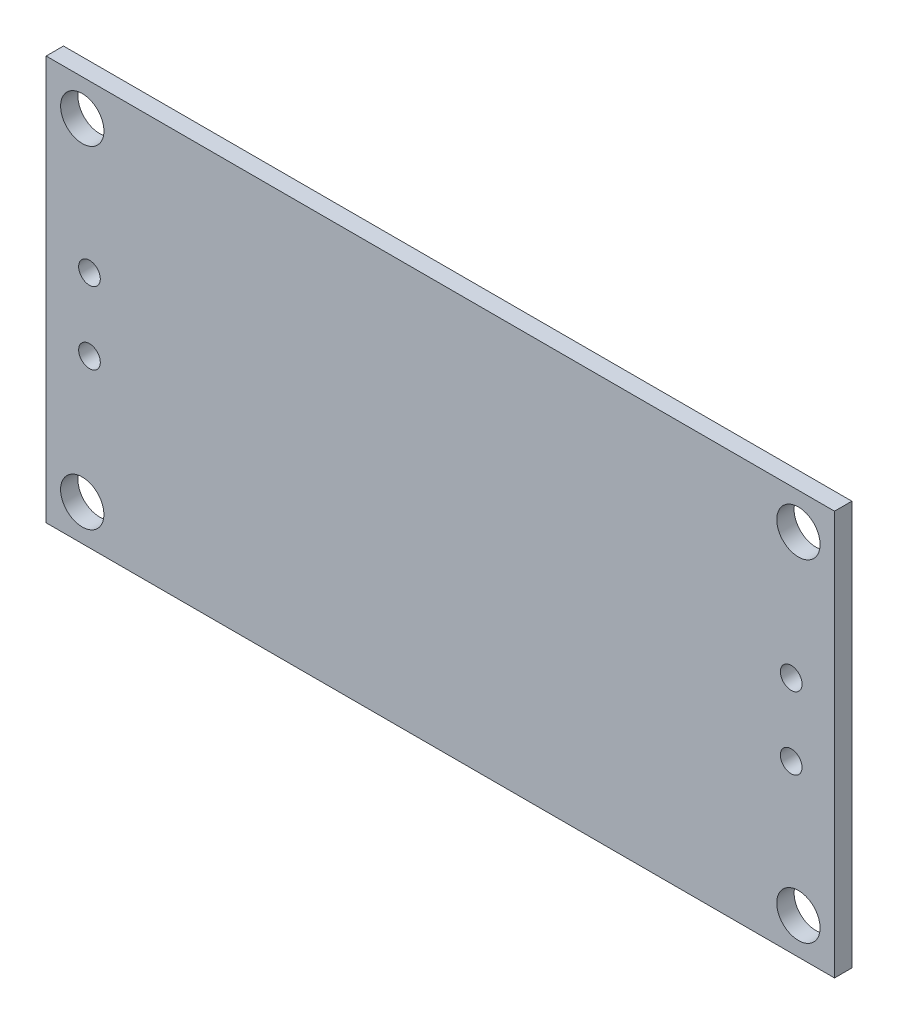
ISO-10303-21;
HEADER;
FILE_DESCRIPTION(('STEP AP214'),'2;1');
FILE_NAME('part.step','',(''),(''),'','','');
FILE_SCHEMA(('AUTOMOTIVE_DESIGN { 1 0 10303 214 1 1 1 1 }'));
ENDSEC;
DATA;
#1=APPLICATION_CONTEXT('core data for automotive mechanical design processes');
#2=APPLICATION_PROTOCOL_DEFINITION('international standard','automotive_design',2000,#1);
#3=PRODUCT_CONTEXT('',#1,'mechanical');
#4=PRODUCT('Part','Part','',(#3));
#5=PRODUCT_RELATED_PRODUCT_CATEGORY('part','',(#4));
#6=PRODUCT_DEFINITION_FORMATION('','',#4);
#7=PRODUCT_DEFINITION_CONTEXT('part definition',#1,'design');
#8=PRODUCT_DEFINITION('design','',#6,#7);
#9=PRODUCT_DEFINITION_SHAPE('','',#8);
#10=(LENGTH_UNIT() NAMED_UNIT(*) SI_UNIT(.MILLI.,.METRE.));
#11=(NAMED_UNIT(*) PLANE_ANGLE_UNIT() SI_UNIT($,.RADIAN.));
#12=(NAMED_UNIT(*) SI_UNIT($,.STERADIAN.) SOLID_ANGLE_UNIT());
#13=UNCERTAINTY_MEASURE_WITH_UNIT(LENGTH_MEASURE(1.E-05),#10,'distance_accuracy_value','');
#14=(GEOMETRIC_REPRESENTATION_CONTEXT(3) GLOBAL_UNCERTAINTY_ASSIGNED_CONTEXT((#13)) GLOBAL_UNIT_ASSIGNED_CONTEXT((#10,
#11,#12)) REPRESENTATION_CONTEXT('',''));
#15=CARTESIAN_POINT('',(0.,0.,0.));
#16=DIRECTION('',(0.,0.,1.));
#17=DIRECTION('',(1.,0.,0.));
#18=AXIS2_PLACEMENT_3D('',#15,#16,#17);
#19=CARTESIAN_POINT('',(27.3,-14.,1.2));
#20=DIRECTION('',(-1.,0.,0.));
#21=DIRECTION('',(0.,0.,1.));
#22=AXIS2_PLACEMENT_3D('',#19,#20,#21);
#23=PLANE('',#22);
#24=DIRECTION('',(0.,1.,0.));
#25=VECTOR('',#24,1.);
#26=CARTESIAN_POINT('',(27.3,-14.,0.));
#27=LINE('',#26,#25);
#28=CARTESIAN_POINT('',(27.3,-14.,0.));
#29=VERTEX_POINT('',#28);
#30=CARTESIAN_POINT('',(27.3,14.,0.));
#31=VERTEX_POINT('',#30);
#32=EDGE_CURVE('E97',#29,#31,#27,.T.);
#33=ORIENTED_EDGE('',*,*,#32,.T.);
#34=DIRECTION('',(0.,0.,-1.));
#35=VECTOR('',#34,1.);
#36=CARTESIAN_POINT('',(27.3,14.,1.2));
#37=LINE('',#36,#35);
#38=CARTESIAN_POINT('',(27.3,14.,1.2));
#39=VERTEX_POINT('',#38);
#40=EDGE_CURVE('E11',#39,#31,#37,.T.);
#41=ORIENTED_EDGE('',*,*,#40,.F.);
#42=DIRECTION('',(0.,1.,0.));
#43=VECTOR('',#42,1.);
#44=CARTESIAN_POINT('',(27.3,-14.,1.2));
#45=LINE('',#44,#43);
#46=CARTESIAN_POINT('',(27.3,-14.,1.2));
#47=VERTEX_POINT('',#46);
#48=EDGE_CURVE('E85',#47,#39,#45,.T.);
#49=ORIENTED_EDGE('',*,*,#48,.F.);
#50=DIRECTION('',(0.,0.,-1.));
#51=VECTOR('',#50,1.);
#52=CARTESIAN_POINT('',(27.3,-14.,1.2));
#53=LINE('',#52,#51);
#54=EDGE_CURVE('E93',#47,#29,#53,.T.);
#55=ORIENTED_EDGE('',*,*,#54,.T.);
#56=EDGE_LOOP('',(#33,#41,#49,#55));
#57=FACE_BOUND('',#56,.T.);
#58=ADVANCED_FACE('F34',(#57),#23,.F.);
#59=CARTESIAN_POINT('',(-27.3,14.,1.2));
#60=DIRECTION('',(0.,-1.,0.));
#61=DIRECTION('',(1.,0.,0.));
#62=AXIS2_PLACEMENT_3D('',#59,#60,#61);
#63=PLANE('',#62);
#64=DIRECTION('',(-1.,0.,0.));
#65=VECTOR('',#64,1.);
#66=CARTESIAN_POINT('',(-27.3,14.,0.));
#67=LINE('',#66,#65);
#68=CARTESIAN_POINT('',(-27.3,14.,0.));
#69=VERTEX_POINT('',#68);
#70=EDGE_CURVE('E89',#31,#69,#67,.T.);
#71=ORIENTED_EDGE('',*,*,#70,.T.);
#72=DIRECTION('',(0.,0.,-1.));
#73=VECTOR('',#72,1.);
#74=CARTESIAN_POINT('',(-27.3,14.,1.2));
#75=LINE('',#74,#73);
#76=CARTESIAN_POINT('',(-27.3,14.,1.2));
#77=VERTEX_POINT('',#76);
#78=EDGE_CURVE('E42',#77,#69,#75,.T.);
#79=ORIENTED_EDGE('',*,*,#78,.F.);
#80=DIRECTION('',(-1.,0.,0.));
#81=VECTOR('',#80,1.);
#82=CARTESIAN_POINT('',(-27.3,14.,1.2));
#83=LINE('',#82,#81);
#84=EDGE_CURVE('E80',#39,#77,#83,.T.);
#85=ORIENTED_EDGE('',*,*,#84,.F.);
#86=ORIENTED_EDGE('',*,*,#40,.T.);
#87=EDGE_LOOP('',(#71,#79,#85,#86));
#88=FACE_BOUND('',#87,.T.);
#89=ADVANCED_FACE('F88',(#88),#63,.F.);
#90=CARTESIAN_POINT('',(-27.3,-14.,1.2));
#91=DIRECTION('',(1.,0.,0.));
#92=DIRECTION('',(0.,0.,-1.));
#93=AXIS2_PLACEMENT_3D('',#90,#91,#92);
#94=PLANE('',#93);
#95=DIRECTION('',(0.,-1.,0.));
#96=VECTOR('',#95,1.);
#97=CARTESIAN_POINT('',(-27.3,-14.,0.));
#98=LINE('',#97,#96);
#99=CARTESIAN_POINT('',(-27.3,-14.,0.));
#100=VERTEX_POINT('',#99);
#101=EDGE_CURVE('E67',#69,#100,#98,.T.);
#102=ORIENTED_EDGE('',*,*,#101,.T.);
#103=DIRECTION('',(0.,0.,-1.));
#104=VECTOR('',#103,1.);
#105=CARTESIAN_POINT('',(-27.3,-14.,1.2));
#106=LINE('',#105,#104);
#107=CARTESIAN_POINT('',(-27.3,-14.,1.2));
#108=VERTEX_POINT('',#107);
#109=EDGE_CURVE('E90',#108,#100,#106,.T.);
#110=ORIENTED_EDGE('',*,*,#109,.F.);
#111=DIRECTION('',(0.,-1.,0.));
#112=VECTOR('',#111,1.);
#113=CARTESIAN_POINT('',(-27.3,-14.,1.2));
#114=LINE('',#113,#112);
#115=EDGE_CURVE('E83',#77,#108,#114,.T.);
#116=ORIENTED_EDGE('',*,*,#115,.F.);
#117=ORIENTED_EDGE('',*,*,#78,.T.);
#118=EDGE_LOOP('',(#102,#110,#116,#117));
#119=FACE_BOUND('',#118,.T.);
#120=ADVANCED_FACE('F91',(#119),#94,.F.);
#121=CARTESIAN_POINT('',(-27.3,-14.,1.2));
#122=DIRECTION('',(0.,1.,0.));
#123=DIRECTION('',(0.,0.,1.));
#124=AXIS2_PLACEMENT_3D('',#121,#122,#123);
#125=PLANE('',#124);
#126=DIRECTION('',(1.,0.,0.));
#127=VECTOR('',#126,1.);
#128=CARTESIAN_POINT('',(-27.3,-14.,0.));
#129=LINE('',#128,#127);
#130=EDGE_CURVE('E73',#100,#29,#129,.T.);
#131=ORIENTED_EDGE('',*,*,#130,.T.);
#132=ORIENTED_EDGE('',*,*,#54,.F.);
#133=DIRECTION('',(1.,0.,0.));
#134=VECTOR('',#133,1.);
#135=CARTESIAN_POINT('',(-27.3,-14.,1.2));
#136=LINE('',#135,#134);
#137=EDGE_CURVE('E50',#108,#47,#136,.T.);
#138=ORIENTED_EDGE('',*,*,#137,.F.);
#139=ORIENTED_EDGE('',*,*,#109,.T.);
#140=EDGE_LOOP('',(#131,#132,#138,#139));
#141=FACE_BOUND('',#140,.T.);
#142=ADVANCED_FACE('F105',(#141),#125,.F.);
#143=CARTESIAN_POINT('',(0.,0.,1.2));
#144=DIRECTION('',(0.,0.,-1.));
#145=DIRECTION('',(-1.,0.,0.));
#146=AXIS2_PLACEMENT_3D('',#143,#144,#145);
#147=PLANE('',#146);
#148=CARTESIAN_POINT('',(24.3,-2.50000000000001,1.2));
#149=DIRECTION('',(0.,0.,1.));
#150=DIRECTION('',(-1.,0.,0.));
#151=AXIS2_PLACEMENT_3D('',#148,#149,#150);
#152=CIRCLE('',#151,0.750000000000002);
#153=CARTESIAN_POINT('',(23.55,-2.50000000000001,1.2));
#154=VERTEX_POINT('',#153);
#155=EDGE_CURVE('E153',#154,#154,#152,.T.);
#156=ORIENTED_EDGE('',*,*,#155,.F.);
#157=EDGE_LOOP('',(#156));
#158=FACE_BOUND('',#157,.T.);
#159=CARTESIAN_POINT('',(-24.3,-2.5,1.2));
#160=DIRECTION('',(0.,0.,1.));
#161=DIRECTION('',(1.,0.,0.));
#162=AXIS2_PLACEMENT_3D('',#159,#160,#161);
#163=CIRCLE('',#162,0.750000000000002);
#164=CARTESIAN_POINT('',(-23.55,-2.5,1.2));
#165=VERTEX_POINT('',#164);
#166=EDGE_CURVE('E147',#165,#165,#163,.T.);
#167=ORIENTED_EDGE('',*,*,#166,.F.);
#168=EDGE_LOOP('',(#167));
#169=FACE_BOUND('',#168,.T.);
#170=CARTESIAN_POINT('',(-24.3,2.50000000000001,1.2));
#171=DIRECTION('',(0.,0.,1.));
#172=DIRECTION('',(-1.,0.,0.));
#173=AXIS2_PLACEMENT_3D('',#170,#171,#172);
#174=CIRCLE('',#173,0.750000000000002);
#175=CARTESIAN_POINT('',(-25.05,2.50000000000001,1.2));
#176=VERTEX_POINT('',#175);
#177=EDGE_CURVE('E141',#176,#176,#174,.T.);
#178=ORIENTED_EDGE('',*,*,#177,.F.);
#179=EDGE_LOOP('',(#178));
#180=FACE_BOUND('',#179,.T.);
#181=CARTESIAN_POINT('',(24.3,2.5,1.2));
#182=DIRECTION('',(0.,0.,1.));
#183=DIRECTION('',(1.,0.,0.));
#184=AXIS2_PLACEMENT_3D('',#181,#182,#183);
#185=CIRCLE('',#184,0.750000000000002);
#186=CARTESIAN_POINT('',(25.05,2.5,1.2));
#187=VERTEX_POINT('',#186);
#188=EDGE_CURVE('E135',#187,#187,#185,.T.);
#189=ORIENTED_EDGE('',*,*,#188,.F.);
#190=EDGE_LOOP('',(#189));
#191=FACE_BOUND('',#190,.T.);
#192=CARTESIAN_POINT('',(24.8,11.5,1.2));
#193=DIRECTION('',(0.,0.,1.));
#194=DIRECTION('',(-1.,0.,0.));
#195=AXIS2_PLACEMENT_3D('',#192,#193,#194);
#196=CIRCLE('',#195,1.5);
#197=CARTESIAN_POINT('',(23.3,11.5,1.2));
#198=VERTEX_POINT('',#197);
#199=EDGE_CURVE('E130',#198,#198,#196,.T.);
#200=ORIENTED_EDGE('',*,*,#199,.F.);
#201=EDGE_LOOP('',(#200));
#202=FACE_BOUND('',#201,.T.);
#203=CARTESIAN_POINT('',(-24.8,-11.5,1.2));
#204=DIRECTION('',(0.,0.,1.));
#205=DIRECTION('',(-1.,0.,0.));
#206=AXIS2_PLACEMENT_3D('',#203,#204,#205);
#207=CIRCLE('',#206,1.5);
#208=CARTESIAN_POINT('',(-26.3,-11.5,1.2));
#209=VERTEX_POINT('',#208);
#210=EDGE_CURVE('E124',#209,#209,#207,.T.);
#211=ORIENTED_EDGE('',*,*,#210,.F.);
#212=EDGE_LOOP('',(#211));
#213=FACE_BOUND('',#212,.T.);
#214=CARTESIAN_POINT('',(24.8,-11.5,1.2));
#215=DIRECTION('',(0.,0.,1.));
#216=DIRECTION('',(1.,0.,0.));
#217=AXIS2_PLACEMENT_3D('',#214,#215,#216);
#218=CIRCLE('',#217,1.5);
#219=CARTESIAN_POINT('',(26.3,-11.5,1.2));
#220=VERTEX_POINT('',#219);
#221=EDGE_CURVE('E117',#220,#220,#218,.T.);
#222=ORIENTED_EDGE('',*,*,#221,.F.);
#223=EDGE_LOOP('',(#222));
#224=FACE_BOUND('',#223,.T.);
#225=CARTESIAN_POINT('',(-24.8,11.5,1.2));
#226=DIRECTION('',(0.,0.,1.));
#227=DIRECTION('',(1.,0.,0.));
#228=AXIS2_PLACEMENT_3D('',#225,#226,#227);
#229=CIRCLE('',#228,1.5);
#230=CARTESIAN_POINT('',(-23.3,11.5,1.2));
#231=VERTEX_POINT('',#230);
#232=EDGE_CURVE('E111',#231,#231,#229,.T.);
#233=ORIENTED_EDGE('',*,*,#232,.F.);
#234=EDGE_LOOP('',(#233));
#235=FACE_BOUND('',#234,.T.);
#236=ORIENTED_EDGE('',*,*,#48,.T.);
#237=ORIENTED_EDGE('',*,*,#84,.T.);
#238=ORIENTED_EDGE('',*,*,#115,.T.);
#239=ORIENTED_EDGE('',*,*,#137,.T.);
#240=EDGE_LOOP('',(#236,#237,#238,#239));
#241=FACE_BOUND('',#240,.T.);
#242=ADVANCED_FACE('F81',(#158,#169,#180,#191,#202,#213,#224,#235,#241),#147,.F.);
#243=CARTESIAN_POINT('',(0.,0.,0.));
#244=DIRECTION('',(0.,0.,-1.));
#245=DIRECTION('',(-1.,0.,0.));
#246=AXIS2_PLACEMENT_3D('',#243,#244,#245);
#247=PLANE('',#246);
#248=CARTESIAN_POINT('',(24.3,-2.50000000000001,0.));
#249=DIRECTION('',(0.,0.,1.));
#250=DIRECTION('',(-1.,0.,0.));
#251=AXIS2_PLACEMENT_3D('',#248,#249,#250);
#252=CIRCLE('',#251,0.750000000000002);
#253=CARTESIAN_POINT('',(23.55,-2.50000000000001,0.));
#254=VERTEX_POINT('',#253);
#255=EDGE_CURVE('E138',#254,#254,#252,.T.);
#256=ORIENTED_EDGE('',*,*,#255,.T.);
#257=EDGE_LOOP('',(#256));
#258=FACE_BOUND('',#257,.T.);
#259=CARTESIAN_POINT('',(-24.3,-2.5,0.));
#260=DIRECTION('',(0.,0.,1.));
#261=DIRECTION('',(1.,0.,0.));
#262=AXIS2_PLACEMENT_3D('',#259,#260,#261);
#263=CIRCLE('',#262,0.750000000000002);
#264=CARTESIAN_POINT('',(-23.55,-2.5,0.));
#265=VERTEX_POINT('',#264);
#266=EDGE_CURVE('E150',#265,#265,#263,.T.);
#267=ORIENTED_EDGE('',*,*,#266,.T.);
#268=EDGE_LOOP('',(#267));
#269=FACE_BOUND('',#268,.T.);
#270=CARTESIAN_POINT('',(-24.3,2.50000000000001,0.));
#271=DIRECTION('',(0.,0.,1.));
#272=DIRECTION('',(-1.,0.,0.));
#273=AXIS2_PLACEMENT_3D('',#270,#271,#272);
#274=CIRCLE('',#273,0.750000000000002);
#275=CARTESIAN_POINT('',(-25.05,2.50000000000001,0.));
#276=VERTEX_POINT('',#275);
#277=EDGE_CURVE('E144',#276,#276,#274,.T.);
#278=ORIENTED_EDGE('',*,*,#277,.T.);
#279=EDGE_LOOP('',(#278));
#280=FACE_BOUND('',#279,.T.);
#281=CARTESIAN_POINT('',(24.3,2.5,0.));
#282=DIRECTION('',(0.,0.,1.));
#283=DIRECTION('',(1.,0.,0.));
#284=AXIS2_PLACEMENT_3D('',#281,#282,#283);
#285=CIRCLE('',#284,0.750000000000002);
#286=CARTESIAN_POINT('',(25.05,2.5,0.));
#287=VERTEX_POINT('',#286);
#288=EDGE_CURVE('E121',#287,#287,#285,.T.);
#289=ORIENTED_EDGE('',*,*,#288,.T.);
#290=EDGE_LOOP('',(#289));
#291=FACE_BOUND('',#290,.T.);
#292=CARTESIAN_POINT('',(24.8,11.5,0.));
#293=DIRECTION('',(0.,0.,1.));
#294=DIRECTION('',(-1.,0.,0.));
#295=AXIS2_PLACEMENT_3D('',#292,#293,#294);
#296=CIRCLE('',#295,1.5);
#297=CARTESIAN_POINT('',(23.3,11.5,0.));
#298=VERTEX_POINT('',#297);
#299=EDGE_CURVE('E114',#298,#298,#296,.T.);
#300=ORIENTED_EDGE('',*,*,#299,.T.);
#301=EDGE_LOOP('',(#300));
#302=FACE_BOUND('',#301,.T.);
#303=CARTESIAN_POINT('',(-24.8,-11.5,0.));
#304=DIRECTION('',(0.,0.,1.));
#305=DIRECTION('',(-1.,0.,0.));
#306=AXIS2_PLACEMENT_3D('',#303,#304,#305);
#307=CIRCLE('',#306,1.5);
#308=CARTESIAN_POINT('',(-26.3,-11.5,0.));
#309=VERTEX_POINT('',#308);
#310=EDGE_CURVE('E127',#309,#309,#307,.T.);
#311=ORIENTED_EDGE('',*,*,#310,.T.);
#312=EDGE_LOOP('',(#311));
#313=FACE_BOUND('',#312,.T.);
#314=CARTESIAN_POINT('',(24.8,-11.5,0.));
#315=DIRECTION('',(0.,0.,1.));
#316=DIRECTION('',(1.,0.,0.));
#317=AXIS2_PLACEMENT_3D('',#314,#315,#316);
#318=CIRCLE('',#317,1.5);
#319=CARTESIAN_POINT('',(26.3,-11.5,0.));
#320=VERTEX_POINT('',#319);
#321=EDGE_CURVE('E120',#320,#320,#318,.T.);
#322=ORIENTED_EDGE('',*,*,#321,.T.);
#323=EDGE_LOOP('',(#322));
#324=FACE_BOUND('',#323,.T.);
#325=CARTESIAN_POINT('',(-24.8,11.5,0.));
#326=DIRECTION('',(0.,0.,1.));
#327=DIRECTION('',(1.,0.,0.));
#328=AXIS2_PLACEMENT_3D('',#325,#326,#327);
#329=CIRCLE('',#328,1.5);
#330=CARTESIAN_POINT('',(-23.3,11.5,0.));
#331=VERTEX_POINT('',#330);
#332=EDGE_CURVE('E100',#331,#331,#329,.T.);
#333=ORIENTED_EDGE('',*,*,#332,.T.);
#334=EDGE_LOOP('',(#333));
#335=FACE_BOUND('',#334,.T.);
#336=ORIENTED_EDGE('',*,*,#32,.F.);
#337=ORIENTED_EDGE('',*,*,#130,.F.);
#338=ORIENTED_EDGE('',*,*,#101,.F.);
#339=ORIENTED_EDGE('',*,*,#70,.F.);
#340=EDGE_LOOP('',(#336,#337,#338,#339));
#341=FACE_BOUND('',#340,.T.);
#342=ADVANCED_FACE('F108',(#258,#269,#280,#291,#302,#313,#324,#335,#341),#247,.T.);
#343=CARTESIAN_POINT('',(-24.8,11.5,0.));
#344=DIRECTION('',(0.,0.,1.));
#345=DIRECTION('',(1.,0.,0.));
#346=AXIS2_PLACEMENT_3D('',#343,#344,#345);
#347=CYLINDRICAL_SURFACE('',#346,1.5);
#348=ORIENTED_EDGE('',*,*,#332,.F.);
#349=EDGE_LOOP('',(#348));
#350=FACE_BOUND('',#349,.T.);
#351=ORIENTED_EDGE('',*,*,#232,.T.);
#352=EDGE_LOOP('',(#351));
#353=FACE_BOUND('',#352,.T.);
#354=ADVANCED_FACE('F185',(#350,#353),#347,.F.);
#355=CARTESIAN_POINT('',(24.8,-11.5,0.));
#356=DIRECTION('',(0.,0.,1.));
#357=DIRECTION('',(1.,0.,0.));
#358=AXIS2_PLACEMENT_3D('',#355,#356,#357);
#359=CYLINDRICAL_SURFACE('',#358,1.5);
#360=ORIENTED_EDGE('',*,*,#321,.F.);
#361=EDGE_LOOP('',(#360));
#362=FACE_BOUND('',#361,.T.);
#363=ORIENTED_EDGE('',*,*,#221,.T.);
#364=EDGE_LOOP('',(#363));
#365=FACE_BOUND('',#364,.T.);
#366=ADVANCED_FACE('F187',(#362,#365),#359,.F.);
#367=CARTESIAN_POINT('',(-24.8,-11.5,0.));
#368=DIRECTION('',(0.,0.,1.));
#369=DIRECTION('',(1.,0.,0.));
#370=AXIS2_PLACEMENT_3D('',#367,#368,#369);
#371=CYLINDRICAL_SURFACE('',#370,1.5);
#372=ORIENTED_EDGE('',*,*,#310,.F.);
#373=EDGE_LOOP('',(#372));
#374=FACE_BOUND('',#373,.T.);
#375=ORIENTED_EDGE('',*,*,#210,.T.);
#376=EDGE_LOOP('',(#375));
#377=FACE_BOUND('',#376,.T.);
#378=ADVANCED_FACE('F194',(#374,#377),#371,.F.);
#379=CARTESIAN_POINT('',(24.8,11.5,0.));
#380=DIRECTION('',(0.,0.,1.));
#381=DIRECTION('',(1.,0.,0.));
#382=AXIS2_PLACEMENT_3D('',#379,#380,#381);
#383=CYLINDRICAL_SURFACE('',#382,1.5);
#384=ORIENTED_EDGE('',*,*,#299,.F.);
#385=EDGE_LOOP('',(#384));
#386=FACE_BOUND('',#385,.T.);
#387=ORIENTED_EDGE('',*,*,#199,.T.);
#388=EDGE_LOOP('',(#387));
#389=FACE_BOUND('',#388,.T.);
#390=ADVANCED_FACE('F234',(#386,#389),#383,.F.);
#391=CARTESIAN_POINT('',(24.3,2.5,0.));
#392=DIRECTION('',(0.,0.,1.));
#393=DIRECTION('',(1.,0.,0.));
#394=AXIS2_PLACEMENT_3D('',#391,#392,#393);
#395=CYLINDRICAL_SURFACE('',#394,0.750000000000002);
#396=ORIENTED_EDGE('',*,*,#288,.F.);
#397=EDGE_LOOP('',(#396));
#398=FACE_BOUND('',#397,.T.);
#399=ORIENTED_EDGE('',*,*,#188,.T.);
#400=EDGE_LOOP('',(#399));
#401=FACE_BOUND('',#400,.T.);
#402=ADVANCED_FACE('F228',(#398,#401),#395,.F.);
#403=CARTESIAN_POINT('',(-24.3,2.50000000000001,0.));
#404=DIRECTION('',(0.,0.,1.));
#405=DIRECTION('',(1.,0.,0.));
#406=AXIS2_PLACEMENT_3D('',#403,#404,#405);
#407=CYLINDRICAL_SURFACE('',#406,0.750000000000002);
#408=ORIENTED_EDGE('',*,*,#277,.F.);
#409=EDGE_LOOP('',(#408));
#410=FACE_BOUND('',#409,.T.);
#411=ORIENTED_EDGE('',*,*,#177,.T.);
#412=EDGE_LOOP('',(#411));
#413=FACE_BOUND('',#412,.T.);
#414=ADVANCED_FACE('F233',(#410,#413),#407,.F.);
#415=CARTESIAN_POINT('',(-24.3,-2.5,0.));
#416=DIRECTION('',(0.,0.,1.));
#417=DIRECTION('',(1.,0.,0.));
#418=AXIS2_PLACEMENT_3D('',#415,#416,#417);
#419=CYLINDRICAL_SURFACE('',#418,0.750000000000002);
#420=ORIENTED_EDGE('',*,*,#266,.F.);
#421=EDGE_LOOP('',(#420));
#422=FACE_BOUND('',#421,.T.);
#423=ORIENTED_EDGE('',*,*,#166,.T.);
#424=EDGE_LOOP('',(#423));
#425=FACE_BOUND('',#424,.T.);
#426=ADVANCED_FACE('F164',(#422,#425),#419,.F.);
#427=CARTESIAN_POINT('',(24.3,-2.50000000000001,0.));
#428=DIRECTION('',(0.,0.,1.));
#429=DIRECTION('',(1.,0.,0.));
#430=AXIS2_PLACEMENT_3D('',#427,#428,#429);
#431=CYLINDRICAL_SURFACE('',#430,0.750000000000002);
#432=ORIENTED_EDGE('',*,*,#255,.F.);
#433=EDGE_LOOP('',(#432));
#434=FACE_BOUND('',#433,.T.);
#435=ORIENTED_EDGE('',*,*,#155,.T.);
#436=EDGE_LOOP('',(#435));
#437=FACE_BOUND('',#436,.T.);
#438=ADVANCED_FACE('F161',(#434,#437),#431,.F.);
#439=CLOSED_SHELL('',(#58,#89,#120,#142,#242,#342,#354,#366,#378,#390,#402,#414,#426,#438));
#440=MANIFOLD_SOLID_BREP('B2',#439);
#441=ADVANCED_BREP_SHAPE_REPRESENTATION('',(#18,#440),#14);
#442=SHAPE_DEFINITION_REPRESENTATION(#9,#441);
ENDSEC;
END-ISO-10303-21;
